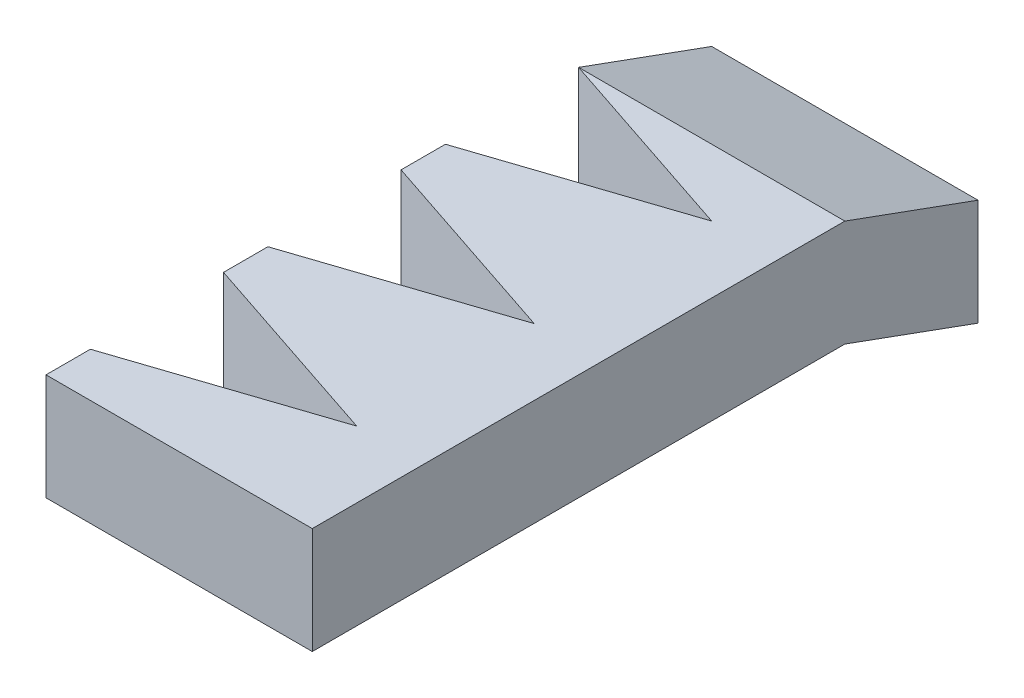
ISO-10303-21;
HEADER;
FILE_DESCRIPTION(('STEP AP214'),'2;1');
FILE_NAME('part.step','',(''),(''),'','','');
FILE_SCHEMA(('AUTOMOTIVE_DESIGN { 1 0 10303 214 1 1 1 1 }'));
ENDSEC;
DATA;
#1=APPLICATION_CONTEXT('core data for automotive mechanical design processes');
#2=APPLICATION_PROTOCOL_DEFINITION('international standard','automotive_design',2000,#1);
#3=PRODUCT_CONTEXT('',#1,'mechanical');
#4=PRODUCT('Part','Part','',(#3));
#5=PRODUCT_RELATED_PRODUCT_CATEGORY('part','',(#4));
#6=PRODUCT_DEFINITION_FORMATION('','',#4);
#7=PRODUCT_DEFINITION_CONTEXT('part definition',#1,'design');
#8=PRODUCT_DEFINITION('design','',#6,#7);
#9=PRODUCT_DEFINITION_SHAPE('','',#8);
#10=(LENGTH_UNIT() NAMED_UNIT(*) SI_UNIT(.MILLI.,.METRE.));
#11=(NAMED_UNIT(*) PLANE_ANGLE_UNIT() SI_UNIT($,.RADIAN.));
#12=(NAMED_UNIT(*) SI_UNIT($,.STERADIAN.) SOLID_ANGLE_UNIT());
#13=UNCERTAINTY_MEASURE_WITH_UNIT(LENGTH_MEASURE(1.E-05),#10,'distance_accuracy_value','');
#14=(GEOMETRIC_REPRESENTATION_CONTEXT(3) GLOBAL_UNCERTAINTY_ASSIGNED_CONTEXT((#13)) GLOBAL_UNIT_ASSIGNED_CONTEXT((#10,
#11,#12)) REPRESENTATION_CONTEXT('',''));
#15=CARTESIAN_POINT('',(0.,0.,0.));
#16=DIRECTION('',(0.,0.,1.));
#17=DIRECTION('',(1.,0.,0.));
#18=AXIS2_PLACEMENT_3D('',#15,#16,#17);
#19=CARTESIAN_POINT('',(0.,12.,0.));
#20=DIRECTION('',(1.,0.,0.));
#21=DIRECTION('',(0.,0.,-1.));
#22=AXIS2_PLACEMENT_3D('',#19,#20,#21);
#23=PLANE('',#22);
#24=DIRECTION('',(0.,-0.342020143325663,-0.939692620785911));
#25=VECTOR('',#24,1.);
#26=CARTESIAN_POINT('',(0.,12.,-60.));
#27=LINE('',#26,#25);
#28=CARTESIAN_POINT('',(0.,12.,-60.));
#29=VERTEX_POINT('',#28);
#30=CARTESIAN_POINT('',(0.,6.54044648600708,-75.));
#31=VERTEX_POINT('',#30);
#32=EDGE_CURVE('E174',#29,#31,#27,.T.);
#33=ORIENTED_EDGE('',*,*,#32,.T.);
#34=DIRECTION('',(0.,-1.,0.));
#35=VECTOR('',#34,1.);
#36=CARTESIAN_POINT('',(0.,12.,-75.));
#37=LINE('',#36,#35);
#38=CARTESIAN_POINT('',(0.,-5.45955351399293,-75.));
#39=VERTEX_POINT('',#38);
#40=EDGE_CURVE('E166',#31,#39,#37,.T.);
#41=ORIENTED_EDGE('',*,*,#40,.T.);
#42=DIRECTION('',(0.,-0.342020143325663,-0.939692620785911));
#43=VECTOR('',#42,1.);
#44=CARTESIAN_POINT('',(0.,0.,-60.));
#45=LINE('',#44,#43);
#46=CARTESIAN_POINT('',(0.,0.,-60.));
#47=VERTEX_POINT('',#46);
#48=EDGE_CURVE('E160',#47,#39,#45,.T.);
#49=ORIENTED_EDGE('',*,*,#48,.F.);
#50=DIRECTION('',(0.,-1.,0.));
#51=VECTOR('',#50,1.);
#52=CARTESIAN_POINT('',(0.,39.0416345659799,-60.));
#53=LINE('',#52,#51);
#54=EDGE_CURVE('E143',#29,#47,#53,.T.);
#55=ORIENTED_EDGE('',*,*,#54,.F.);
#56=EDGE_LOOP('',(#33,#41,#49,#55));
#57=FACE_BOUND('',#56,.T.);
#58=ADVANCED_FACE('F35',(#57),#23,.F.);
#59=CARTESIAN_POINT('',(0.,12.,0.));
#60=DIRECTION('',(0.,-1.,0.));
#61=DIRECTION('',(0.,0.,-1.));
#62=AXIS2_PLACEMENT_3D('',#59,#60,#61);
#63=PLANE('',#62);
#64=DIRECTION('',(-1.,0.,0.));
#65=VECTOR('',#64,1.);
#66=CARTESIAN_POINT('',(45.9626665871386,12.,-60.));
#67=LINE('',#66,#65);
#68=CARTESIAN_POINT('',(30.,12.,-60.));
#69=VERTEX_POINT('',#68);
#70=EDGE_CURVE('E173',#69,#29,#67,.T.);
#71=ORIENTED_EDGE('',*,*,#70,.T.);
#72=DIRECTION('',(0.948683298050514,0.,0.316227766016838));
#73=VECTOR('',#72,1.);
#74=CARTESIAN_POINT('',(22.5,12.,-52.5));
#75=LINE('',#74,#73);
#76=CARTESIAN_POINT('',(22.5,12.,-52.5));
#77=VERTEX_POINT('',#76);
#78=EDGE_CURVE('E149',#29,#77,#75,.T.);
#79=ORIENTED_EDGE('',*,*,#78,.T.);
#80=DIRECTION('',(-0.948683298050514,0.,0.316227766016838));
#81=VECTOR('',#80,1.);
#82=CARTESIAN_POINT('',(0.,12.,-45.));
#83=LINE('',#82,#81);
#84=CARTESIAN_POINT('',(0.,12.,-45.));
#85=VERTEX_POINT('',#84);
#86=EDGE_CURVE('E189',#77,#85,#83,.T.);
#87=ORIENTED_EDGE('',*,*,#86,.T.);
#88=DIRECTION('',(0.,0.,1.));
#89=VECTOR('',#88,1.);
#90=CARTESIAN_POINT('',(0.,12.,0.));
#91=LINE('',#90,#89);
#92=CARTESIAN_POINT('',(0.,12.,-40.));
#93=VERTEX_POINT('',#92);
#94=EDGE_CURVE('E233',#85,#93,#91,.T.);
#95=ORIENTED_EDGE('',*,*,#94,.T.);
#96=DIRECTION('',(0.948683298050514,0.,0.316227766016838));
#97=VECTOR('',#96,1.);
#98=CARTESIAN_POINT('',(22.5,12.,-32.5));
#99=LINE('',#98,#97);
#100=CARTESIAN_POINT('',(22.5,12.,-32.5));
#101=VERTEX_POINT('',#100);
#102=EDGE_CURVE('E184',#93,#101,#99,.T.);
#103=ORIENTED_EDGE('',*,*,#102,.T.);
#104=DIRECTION('',(-0.948683298050514,0.,0.316227766016838));
#105=VECTOR('',#104,1.);
#106=CARTESIAN_POINT('',(0.,12.,-25.));
#107=LINE('',#106,#105);
#108=CARTESIAN_POINT('',(0.,12.,-25.));
#109=VERTEX_POINT('',#108);
#110=EDGE_CURVE('E180',#101,#109,#107,.T.);
#111=ORIENTED_EDGE('',*,*,#110,.T.);
#112=CARTESIAN_POINT('',(0.,12.,-20.));
#113=VERTEX_POINT('',#112);
#114=EDGE_CURVE('E231',#109,#113,#91,.T.);
#115=ORIENTED_EDGE('',*,*,#114,.T.);
#116=DIRECTION('',(0.948683298050514,0.,0.316227766016838));
#117=VECTOR('',#116,1.);
#118=CARTESIAN_POINT('',(22.5,12.,-12.5));
#119=LINE('',#118,#117);
#120=CARTESIAN_POINT('',(22.5,12.,-12.5));
#121=VERTEX_POINT('',#120);
#122=EDGE_CURVE('E214',#113,#121,#119,.T.);
#123=ORIENTED_EDGE('',*,*,#122,.T.);
#124=DIRECTION('',(-0.948683298050514,0.,0.316227766016838));
#125=VECTOR('',#124,1.);
#126=CARTESIAN_POINT('',(0.,12.,-5.));
#127=LINE('',#126,#125);
#128=CARTESIAN_POINT('',(0.,12.,-5.));
#129=VERTEX_POINT('',#128);
#130=EDGE_CURVE('E210',#121,#129,#127,.T.);
#131=ORIENTED_EDGE('',*,*,#130,.T.);
#132=CARTESIAN_POINT('',(0.,12.,0.));
#133=VERTEX_POINT('',#132);
#134=EDGE_CURVE('E234',#129,#133,#91,.T.);
#135=ORIENTED_EDGE('',*,*,#134,.T.);
#136=DIRECTION('',(1.,0.,0.));
#137=VECTOR('',#136,1.);
#138=CARTESIAN_POINT('',(0.,12.,0.));
#139=LINE('',#138,#137);
#140=CARTESIAN_POINT('',(30.,12.,0.));
#141=VERTEX_POINT('',#140);
#142=EDGE_CURVE('E235',#133,#141,#139,.T.);
#143=ORIENTED_EDGE('',*,*,#142,.T.);
#144=DIRECTION('',(0.,0.,-1.));
#145=VECTOR('',#144,1.);
#146=CARTESIAN_POINT('',(30.,12.,0.));
#147=LINE('',#146,#145);
#148=EDGE_CURVE('E237',#141,#69,#147,.T.);
#149=ORIENTED_EDGE('',*,*,#148,.T.);
#150=EDGE_LOOP('',(#71,#79,#87,#95,#103,#111,#115,#123,#131,#135,#143,#149));
#151=FACE_BOUND('',#150,.T.);
#152=ADVANCED_FACE('F276',(#151),#63,.F.);
#153=CARTESIAN_POINT('',(30.,12.,0.));
#154=DIRECTION('',(-1.,0.,0.));
#155=DIRECTION('',(0.,0.,1.));
#156=AXIS2_PLACEMENT_3D('',#153,#154,#155);
#157=PLANE('',#156);
#158=DIRECTION('',(0.,0.342020143325663,0.939692620785911));
#159=VECTOR('',#158,1.);
#160=CARTESIAN_POINT('',(30.,12.,-60.));
#161=LINE('',#160,#159);
#162=CARTESIAN_POINT('',(30.,6.54044648600708,-75.));
#163=VERTEX_POINT('',#162);
#164=EDGE_CURVE('E58',#163,#69,#161,.T.);
#165=ORIENTED_EDGE('',*,*,#164,.T.);
#166=ORIENTED_EDGE('',*,*,#148,.F.);
#167=DIRECTION('',(0.,-1.,0.));
#168=VECTOR('',#167,1.);
#169=CARTESIAN_POINT('',(30.,12.,0.));
#170=LINE('',#169,#168);
#171=CARTESIAN_POINT('',(30.,0.,0.));
#172=VERTEX_POINT('',#171);
#173=EDGE_CURVE('E43',#141,#172,#170,.T.);
#174=ORIENTED_EDGE('',*,*,#173,.T.);
#175=DIRECTION('',(0.,0.,-1.));
#176=VECTOR('',#175,1.);
#177=CARTESIAN_POINT('',(30.,0.,0.));
#178=LINE('',#177,#176);
#179=CARTESIAN_POINT('',(30.,0.,-60.));
#180=VERTEX_POINT('',#179);
#181=EDGE_CURVE('E245',#172,#180,#178,.T.);
#182=ORIENTED_EDGE('',*,*,#181,.T.);
#183=DIRECTION('',(0.,0.342020143325663,0.939692620785911));
#184=VECTOR('',#183,1.);
#185=CARTESIAN_POINT('',(30.,0.,-60.));
#186=LINE('',#185,#184);
#187=CARTESIAN_POINT('',(30.,-5.45955351399293,-75.));
#188=VERTEX_POINT('',#187);
#189=EDGE_CURVE('E162',#188,#180,#186,.T.);
#190=ORIENTED_EDGE('',*,*,#189,.F.);
#191=DIRECTION('',(0.,-1.,0.));
#192=VECTOR('',#191,1.);
#193=CARTESIAN_POINT('',(30.,12.,-75.));
#194=LINE('',#193,#192);
#195=EDGE_CURVE('E248',#163,#188,#194,.T.);
#196=ORIENTED_EDGE('',*,*,#195,.F.);
#197=EDGE_LOOP('',(#165,#166,#174,#182,#190,#196));
#198=FACE_BOUND('',#197,.T.);
#199=ADVANCED_FACE('F253',(#198),#157,.F.);
#200=CARTESIAN_POINT('',(0.,12.,-75.));
#201=DIRECTION('',(0.,0.,1.));
#202=DIRECTION('',(1.,0.,0.));
#203=AXIS2_PLACEMENT_3D('',#200,#201,#202);
#204=PLANE('',#203);
#205=DIRECTION('',(-1.,0.,0.));
#206=VECTOR('',#205,1.);
#207=CARTESIAN_POINT('',(45.9626665871386,6.54044648600708,-75.));
#208=LINE('',#207,#206);
#209=EDGE_CURVE('E176',#163,#31,#208,.T.);
#210=ORIENTED_EDGE('',*,*,#209,.F.);
#211=ORIENTED_EDGE('',*,*,#195,.T.);
#212=DIRECTION('',(-1.,0.,0.));
#213=VECTOR('',#212,1.);
#214=CARTESIAN_POINT('',(45.9626665871386,-5.45955351399293,-75.));
#215=LINE('',#214,#213);
#216=EDGE_CURVE('E163',#188,#39,#215,.T.);
#217=ORIENTED_EDGE('',*,*,#216,.T.);
#218=ORIENTED_EDGE('',*,*,#40,.F.);
#219=EDGE_LOOP('',(#210,#211,#217,#218));
#220=FACE_BOUND('',#219,.T.);
#221=ADVANCED_FACE('F307',(#220),#204,.F.);
#222=DIRECTION('',(0.,-1.,0.));
#223=VECTOR('',#222,1.);
#224=CARTESIAN_POINT('',(0.,39.0416345659799,-40.));
#225=LINE('',#224,#223);
#226=CARTESIAN_POINT('',(0.,0.,-40.));
#227=VERTEX_POINT('',#226);
#228=EDGE_CURVE('E192',#93,#227,#225,.T.);
#229=ORIENTED_EDGE('',*,*,#228,.F.);
#230=ORIENTED_EDGE('',*,*,#94,.F.);
#231=DIRECTION('',(0.,-1.,0.));
#232=VECTOR('',#231,1.);
#233=CARTESIAN_POINT('',(0.,39.0416345659799,-45.));
#234=LINE('',#233,#232);
#235=CARTESIAN_POINT('',(0.,0.,-45.));
#236=VERTEX_POINT('',#235);
#237=EDGE_CURVE('E206',#85,#236,#234,.T.);
#238=ORIENTED_EDGE('',*,*,#237,.T.);
#239=DIRECTION('',(0.,0.,1.));
#240=VECTOR('',#239,1.);
#241=CARTESIAN_POINT('',(0.,0.,0.));
#242=LINE('',#241,#240);
#243=EDGE_CURVE('E242',#236,#227,#242,.T.);
#244=ORIENTED_EDGE('',*,*,#243,.T.);
#245=EDGE_LOOP('',(#229,#230,#238,#244));
#246=FACE_BOUND('',#245,.T.);
#247=ADVANCED_FACE('F37',(#246),#23,.F.);
#248=DIRECTION('',(0.,-1.,0.));
#249=VECTOR('',#248,1.);
#250=CARTESIAN_POINT('',(0.,39.0416345659799,-25.));
#251=LINE('',#250,#249);
#252=CARTESIAN_POINT('',(0.,0.,-25.));
#253=VERTEX_POINT('',#252);
#254=EDGE_CURVE('E197',#109,#253,#251,.T.);
#255=ORIENTED_EDGE('',*,*,#254,.T.);
#256=CARTESIAN_POINT('',(0.,0.,-20.));
#257=VERTEX_POINT('',#256);
#258=EDGE_CURVE('E240',#253,#257,#242,.T.);
#259=ORIENTED_EDGE('',*,*,#258,.T.);
#260=DIRECTION('',(0.,-1.,0.));
#261=VECTOR('',#260,1.);
#262=CARTESIAN_POINT('',(0.,39.0416345659799,-20.));
#263=LINE('',#262,#261);
#264=EDGE_CURVE('E220',#113,#257,#263,.T.);
#265=ORIENTED_EDGE('',*,*,#264,.F.);
#266=ORIENTED_EDGE('',*,*,#114,.F.);
#267=EDGE_LOOP('',(#255,#259,#265,#266));
#268=FACE_BOUND('',#267,.T.);
#269=ADVANCED_FACE('F280',(#268),#23,.F.);
#270=CARTESIAN_POINT('',(0.,0.,0.));
#271=DIRECTION('',(0.,-1.,0.));
#272=DIRECTION('',(0.,0.,-1.));
#273=AXIS2_PLACEMENT_3D('',#270,#271,#272);
#274=PLANE('',#273);
#275=DIRECTION('',(-1.,0.,0.));
#276=VECTOR('',#275,1.);
#277=CARTESIAN_POINT('',(45.9626665871386,0.,-60.));
#278=LINE('',#277,#276);
#279=EDGE_CURVE('E50',#180,#47,#278,.T.);
#280=ORIENTED_EDGE('',*,*,#279,.F.);
#281=ORIENTED_EDGE('',*,*,#181,.F.);
#282=DIRECTION('',(1.,0.,0.));
#283=VECTOR('',#282,1.);
#284=CARTESIAN_POINT('',(0.,0.,0.));
#285=LINE('',#284,#283);
#286=CARTESIAN_POINT('',(0.,0.,0.));
#287=VERTEX_POINT('',#286);
#288=EDGE_CURVE('E243',#287,#172,#285,.T.);
#289=ORIENTED_EDGE('',*,*,#288,.F.);
#290=CARTESIAN_POINT('',(0.,0.,-5.));
#291=VERTEX_POINT('',#290);
#292=EDGE_CURVE('E213',#291,#287,#242,.T.);
#293=ORIENTED_EDGE('',*,*,#292,.F.);
#294=DIRECTION('',(0.948683298050514,0.,-0.316227766016838));
#295=VECTOR('',#294,1.);
#296=CARTESIAN_POINT('',(0.,0.,-5.));
#297=LINE('',#296,#295);
#298=CARTESIAN_POINT('',(22.5,0.,-12.5));
#299=VERTEX_POINT('',#298);
#300=EDGE_CURVE('E183',#291,#299,#297,.T.);
#301=ORIENTED_EDGE('',*,*,#300,.T.);
#302=DIRECTION('',(-0.948683298050514,0.,-0.316227766016838));
#303=VECTOR('',#302,1.);
#304=CARTESIAN_POINT('',(22.5,0.,-12.5));
#305=LINE('',#304,#303);
#306=EDGE_CURVE('E217',#299,#257,#305,.T.);
#307=ORIENTED_EDGE('',*,*,#306,.T.);
#308=ORIENTED_EDGE('',*,*,#258,.F.);
#309=DIRECTION('',(0.948683298050514,0.,-0.316227766016838));
#310=VECTOR('',#309,1.);
#311=CARTESIAN_POINT('',(0.,0.,-25.));
#312=LINE('',#311,#310);
#313=CARTESIAN_POINT('',(22.5,0.,-32.5));
#314=VERTEX_POINT('',#313);
#315=EDGE_CURVE('E185',#253,#314,#312,.T.);
#316=ORIENTED_EDGE('',*,*,#315,.T.);
#317=DIRECTION('',(-0.948683298050514,0.,-0.316227766016838));
#318=VECTOR('',#317,1.);
#319=CARTESIAN_POINT('',(22.5,0.,-32.5));
#320=LINE('',#319,#318);
#321=EDGE_CURVE('E188',#314,#227,#320,.T.);
#322=ORIENTED_EDGE('',*,*,#321,.T.);
#323=ORIENTED_EDGE('',*,*,#243,.F.);
#324=DIRECTION('',(0.948683298050514,0.,-0.316227766016838));
#325=VECTOR('',#324,1.);
#326=CARTESIAN_POINT('',(0.,0.,-45.));
#327=LINE('',#326,#325);
#328=CARTESIAN_POINT('',(22.5,0.,-52.5));
#329=VERTEX_POINT('',#328);
#330=EDGE_CURVE('E139',#236,#329,#327,.T.);
#331=ORIENTED_EDGE('',*,*,#330,.T.);
#332=DIRECTION('',(-0.948683298050514,0.,-0.316227766016838));
#333=VECTOR('',#332,1.);
#334=CARTESIAN_POINT('',(22.5,0.,-52.5));
#335=LINE('',#334,#333);
#336=EDGE_CURVE('E135',#329,#47,#335,.T.);
#337=ORIENTED_EDGE('',*,*,#336,.T.);
#338=EDGE_LOOP('',(#280,#281,#289,#293,#301,#307,#308,#316,#322,#323,#331,#337));
#339=FACE_BOUND('',#338,.T.);
#340=ADVANCED_FACE('F137',(#339),#274,.T.);
#341=DIRECTION('',(0.,-1.,0.));
#342=VECTOR('',#341,1.);
#343=CARTESIAN_POINT('',(0.,39.0416345659799,-5.));
#344=LINE('',#343,#342);
#345=EDGE_CURVE('E226',#129,#291,#344,.T.);
#346=ORIENTED_EDGE('',*,*,#345,.T.);
#347=ORIENTED_EDGE('',*,*,#292,.T.);
#348=DIRECTION('',(0.,-1.,0.));
#349=VECTOR('',#348,1.);
#350=CARTESIAN_POINT('',(0.,12.,0.));
#351=LINE('',#350,#349);
#352=EDGE_CURVE('E11',#133,#287,#351,.T.);
#353=ORIENTED_EDGE('',*,*,#352,.F.);
#354=ORIENTED_EDGE('',*,*,#134,.F.);
#355=EDGE_LOOP('',(#346,#347,#353,#354));
#356=FACE_BOUND('',#355,.T.);
#357=ADVANCED_FACE('F262',(#356),#23,.F.);
#358=CARTESIAN_POINT('',(0.,12.,0.));
#359=DIRECTION('',(0.,0.,-1.));
#360=DIRECTION('',(-1.,0.,0.));
#361=AXIS2_PLACEMENT_3D('',#358,#359,#360);
#362=PLANE('',#361);
#363=ORIENTED_EDGE('',*,*,#288,.T.);
#364=ORIENTED_EDGE('',*,*,#173,.F.);
#365=ORIENTED_EDGE('',*,*,#142,.F.);
#366=ORIENTED_EDGE('',*,*,#352,.T.);
#367=EDGE_LOOP('',(#363,#364,#365,#366));
#368=FACE_BOUND('',#367,.T.);
#369=ADVANCED_FACE('F259',(#368),#362,.F.);
#370=CARTESIAN_POINT('',(22.5,39.0416345659799,-12.5));
#371=DIRECTION('',(-0.316227766016838,0.,0.948683298050514));
#372=DIRECTION('',(0.948683298050514,0.,0.316227766016838));
#373=AXIS2_PLACEMENT_3D('',#370,#371,#372);
#374=PLANE('',#373);
#375=ORIENTED_EDGE('',*,*,#264,.T.);
#376=ORIENTED_EDGE('',*,*,#306,.F.);
#377=DIRECTION('',(0.,-1.,0.));
#378=VECTOR('',#377,1.);
#379=CARTESIAN_POINT('',(22.5,39.0416345659799,-12.5));
#380=LINE('',#379,#378);
#381=EDGE_CURVE('E223',#121,#299,#380,.T.);
#382=ORIENTED_EDGE('',*,*,#381,.F.);
#383=ORIENTED_EDGE('',*,*,#122,.F.);
#384=EDGE_LOOP('',(#375,#376,#382,#383));
#385=FACE_BOUND('',#384,.T.);
#386=ADVANCED_FACE('F282',(#385),#374,.T.);
#387=CARTESIAN_POINT('',(0.,39.0416345659799,-5.));
#388=DIRECTION('',(-0.316227766016838,0.,-0.948683298050514));
#389=DIRECTION('',(-0.948683298050514,0.,0.316227766016838));
#390=AXIS2_PLACEMENT_3D('',#387,#388,#389);
#391=PLANE('',#390);
#392=ORIENTED_EDGE('',*,*,#381,.T.);
#393=ORIENTED_EDGE('',*,*,#300,.F.);
#394=ORIENTED_EDGE('',*,*,#345,.F.);
#395=ORIENTED_EDGE('',*,*,#130,.F.);
#396=EDGE_LOOP('',(#392,#393,#394,#395));
#397=FACE_BOUND('',#396,.T.);
#398=ADVANCED_FACE('F285',(#397),#391,.T.);
#399=CARTESIAN_POINT('',(22.5,39.0416345659799,-52.5));
#400=DIRECTION('',(-0.316227766016838,0.,0.948683298050514));
#401=DIRECTION('',(0.948683298050514,0.,0.316227766016838));
#402=AXIS2_PLACEMENT_3D('',#399,#400,#401);
#403=PLANE('',#402);
#404=ORIENTED_EDGE('',*,*,#54,.T.);
#405=ORIENTED_EDGE('',*,*,#336,.F.);
#406=DIRECTION('',(0.,-1.,0.));
#407=VECTOR('',#406,1.);
#408=CARTESIAN_POINT('',(22.5,39.0416345659799,-52.5));
#409=LINE('',#408,#407);
#410=EDGE_CURVE('E153',#77,#329,#409,.T.);
#411=ORIENTED_EDGE('',*,*,#410,.F.);
#412=ORIENTED_EDGE('',*,*,#78,.F.);
#413=EDGE_LOOP('',(#404,#405,#411,#412));
#414=FACE_BOUND('',#413,.T.);
#415=ADVANCED_FACE('F147',(#414),#403,.T.);
#416=CARTESIAN_POINT('',(0.,39.0416345659799,-45.));
#417=DIRECTION('',(-0.316227766016838,0.,-0.948683298050514));
#418=DIRECTION('',(-0.948683298050514,0.,0.316227766016838));
#419=AXIS2_PLACEMENT_3D('',#416,#417,#418);
#420=PLANE('',#419);
#421=ORIENTED_EDGE('',*,*,#410,.T.);
#422=ORIENTED_EDGE('',*,*,#330,.F.);
#423=ORIENTED_EDGE('',*,*,#237,.F.);
#424=ORIENTED_EDGE('',*,*,#86,.F.);
#425=EDGE_LOOP('',(#421,#422,#423,#424));
#426=FACE_BOUND('',#425,.T.);
#427=ADVANCED_FACE('F287',(#426),#420,.T.);
#428=CARTESIAN_POINT('',(22.5,39.0416345659799,-32.5));
#429=DIRECTION('',(-0.316227766016838,0.,0.948683298050514));
#430=DIRECTION('',(0.948683298050514,0.,0.316227766016838));
#431=AXIS2_PLACEMENT_3D('',#428,#429,#430);
#432=PLANE('',#431);
#433=ORIENTED_EDGE('',*,*,#228,.T.);
#434=ORIENTED_EDGE('',*,*,#321,.F.);
#435=DIRECTION('',(0.,-1.,0.));
#436=VECTOR('',#435,1.);
#437=CARTESIAN_POINT('',(22.5,39.0416345659799,-32.5));
#438=LINE('',#437,#436);
#439=EDGE_CURVE('E194',#101,#314,#438,.T.);
#440=ORIENTED_EDGE('',*,*,#439,.F.);
#441=ORIENTED_EDGE('',*,*,#102,.F.);
#442=EDGE_LOOP('',(#433,#434,#440,#441));
#443=FACE_BOUND('',#442,.T.);
#444=ADVANCED_FACE('F271',(#443),#432,.T.);
#445=CARTESIAN_POINT('',(0.,39.0416345659799,-25.));
#446=DIRECTION('',(-0.316227766016838,0.,-0.948683298050514));
#447=DIRECTION('',(-0.948683298050514,0.,0.316227766016838));
#448=AXIS2_PLACEMENT_3D('',#445,#446,#447);
#449=PLANE('',#448);
#450=ORIENTED_EDGE('',*,*,#439,.T.);
#451=ORIENTED_EDGE('',*,*,#315,.F.);
#452=ORIENTED_EDGE('',*,*,#254,.F.);
#453=ORIENTED_EDGE('',*,*,#110,.F.);
#454=EDGE_LOOP('',(#450,#451,#452,#453));
#455=FACE_BOUND('',#454,.T.);
#456=ADVANCED_FACE('F273',(#455),#449,.T.);
#457=CARTESIAN_POINT('',(45.9626665871386,12.,-60.));
#458=DIRECTION('',(0.,0.939692620785911,-0.342020143325663));
#459=DIRECTION('',(0.,0.342020143325663,0.939692620785911));
#460=AXIS2_PLACEMENT_3D('',#457,#458,#459);
#461=PLANE('',#460);
#462=ORIENTED_EDGE('',*,*,#209,.T.);
#463=ORIENTED_EDGE('',*,*,#32,.F.);
#464=ORIENTED_EDGE('',*,*,#70,.F.);
#465=ORIENTED_EDGE('',*,*,#164,.F.);
#466=EDGE_LOOP('',(#462,#463,#464,#465));
#467=FACE_BOUND('',#466,.T.);
#468=ADVANCED_FACE('F333',(#467),#461,.T.);
#469=CARTESIAN_POINT('',(45.9626665871386,0.,-60.));
#470=DIRECTION('',(0.,0.939692620785911,-0.342020143325663));
#471=DIRECTION('',(0.,0.342020143325663,0.939692620785911));
#472=AXIS2_PLACEMENT_3D('',#469,#470,#471);
#473=PLANE('',#472);
#474=ORIENTED_EDGE('',*,*,#216,.F.);
#475=ORIENTED_EDGE('',*,*,#189,.T.);
#476=ORIENTED_EDGE('',*,*,#279,.T.);
#477=ORIENTED_EDGE('',*,*,#48,.T.);
#478=EDGE_LOOP('',(#474,#475,#476,#477));
#479=FACE_BOUND('',#478,.T.);
#480=ADVANCED_FACE('F159',(#479),#473,.F.);
#481=CLOSED_SHELL('',(#58,#152,#199,#221,#247,#269,#340,#357,#369,#386,#398,#415,#427,#444,#456,
#468,#480));
#482=MANIFOLD_SOLID_BREP('B2',#481);
#483=ADVANCED_BREP_SHAPE_REPRESENTATION('',(#18,#482),#14);
#484=SHAPE_DEFINITION_REPRESENTATION(#9,#483);
ENDSEC;
END-ISO-10303-21;
